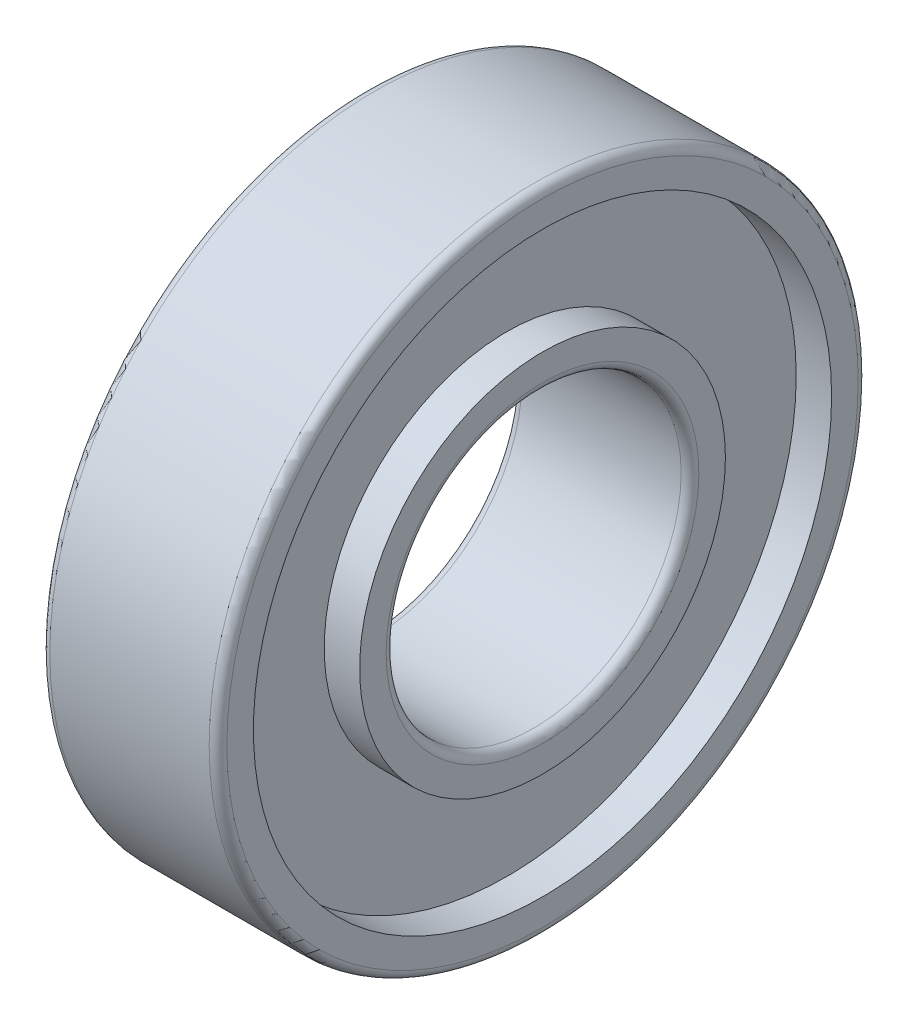
ISO-10303-21;
HEADER;
FILE_DESCRIPTION(('STEP AP214'),'2;1');
FILE_NAME('part.step','',(''),(''),'','','');
FILE_SCHEMA(('AUTOMOTIVE_DESIGN { 1 0 10303 214 1 1 1 1 }'));
ENDSEC;
DATA;
#1=APPLICATION_CONTEXT('core data for automotive mechanical design processes');
#2=APPLICATION_PROTOCOL_DEFINITION('international standard','automotive_design',2000,#1);
#3=PRODUCT_CONTEXT('',#1,'mechanical');
#4=PRODUCT('Part','Part','',(#3));
#5=PRODUCT_RELATED_PRODUCT_CATEGORY('part','',(#4));
#6=PRODUCT_DEFINITION_FORMATION('','',#4);
#7=PRODUCT_DEFINITION_CONTEXT('part definition',#1,'design');
#8=PRODUCT_DEFINITION('design','',#6,#7);
#9=PRODUCT_DEFINITION_SHAPE('','',#8);
#10=(LENGTH_UNIT() NAMED_UNIT(*) SI_UNIT(.MILLI.,.METRE.));
#11=(NAMED_UNIT(*) PLANE_ANGLE_UNIT() SI_UNIT($,.RADIAN.));
#12=(NAMED_UNIT(*) SI_UNIT($,.STERADIAN.) SOLID_ANGLE_UNIT());
#13=UNCERTAINTY_MEASURE_WITH_UNIT(LENGTH_MEASURE(1.E-05),#10,'distance_accuracy_value','');
#14=(GEOMETRIC_REPRESENTATION_CONTEXT(3) GLOBAL_UNCERTAINTY_ASSIGNED_CONTEXT((#13)) GLOBAL_UNIT_ASSIGNED_CONTEXT((#10,
#11,#12)) REPRESENTATION_CONTEXT('',''));
#15=CARTESIAN_POINT('',(0.,0.,0.));
#16=DIRECTION('',(0.,0.,1.));
#17=DIRECTION('',(1.,0.,0.));
#18=AXIS2_PLACEMENT_3D('',#15,#16,#17);
#19=CARTESIAN_POINT('',(0.,6.2,0.));
#20=DIRECTION('',(-1.,0.,0.));
#21=DIRECTION('',(0.,0.,1.));
#22=AXIS2_PLACEMENT_3D('',#19,#20,#21);
#23=PLANE('',#22);
#24=CARTESIAN_POINT('',(0.,0.,0.));
#25=DIRECTION('',(1.,0.,0.));
#26=DIRECTION('',(0.,0.,-1.));
#27=AXIS2_PLACEMENT_3D('',#24,#25,#26);
#28=CIRCLE('',#27,6.2);
#29=CARTESIAN_POINT('',(0.,0.,-6.2));
#30=VERTEX_POINT('',#29);
#31=EDGE_CURVE('E40',#30,#30,#28,.T.);
#32=ORIENTED_EDGE('',*,*,#31,.F.);
#33=EDGE_LOOP('',(#32));
#34=FACE_BOUND('',#33,.T.);
#35=CARTESIAN_POINT('',(0.,0.,0.));
#36=DIRECTION('',(1.,0.,0.));
#37=DIRECTION('',(0.,0.,-1.));
#38=AXIS2_PLACEMENT_3D('',#35,#36,#37);
#39=CIRCLE('',#38,5.3);
#40=CARTESIAN_POINT('',(0.,0.,-5.3));
#41=VERTEX_POINT('',#40);
#42=EDGE_CURVE('E11',#41,#41,#39,.T.);
#43=ORIENTED_EDGE('',*,*,#42,.T.);
#44=EDGE_LOOP('',(#43));
#45=FACE_BOUND('',#44,.T.);
#46=ADVANCED_FACE('F17',(#34,#45),#23,.T.);
#47=CARTESIAN_POINT('',(0.3,0.,0.));
#48=DIRECTION('',(1.,0.,0.));
#49=DIRECTION('',(0.,0.,-1.));
#50=AXIS2_PLACEMENT_3D('',#47,#48,#49);
#51=TOROIDAL_SURFACE('',#50,5.3,0.3);
#52=ORIENTED_EDGE('',*,*,#42,.F.);
#53=EDGE_LOOP('',(#52));
#54=FACE_BOUND('',#53,.T.);
#55=CARTESIAN_POINT('',(0.3,0.,0.));
#56=DIRECTION('',(1.,0.,0.));
#57=DIRECTION('',(0.,0.,-1.));
#58=AXIS2_PLACEMENT_3D('',#55,#56,#57);
#59=CIRCLE('',#58,5.);
#60=CARTESIAN_POINT('',(0.3,0.,-5.));
#61=VERTEX_POINT('',#60);
#62=EDGE_CURVE('E28',#61,#61,#59,.T.);
#63=ORIENTED_EDGE('',*,*,#62,.T.);
#64=EDGE_LOOP('',(#63));
#65=FACE_BOUND('',#64,.T.);
#66=ADVANCED_FACE('F169',(#54,#65),#51,.T.);
#67=CARTESIAN_POINT('',(6.,0.,0.));
#68=DIRECTION('',(-1.,0.,0.));
#69=DIRECTION('',(0.,0.,-1.));
#70=AXIS2_PLACEMENT_3D('',#67,#68,#69);
#71=CYLINDRICAL_SURFACE('',#70,5.);
#72=ORIENTED_EDGE('',*,*,#62,.F.);
#73=EDGE_LOOP('',(#72));
#74=FACE_BOUND('',#73,.T.);
#75=CARTESIAN_POINT('',(5.7,0.,0.));
#76=DIRECTION('',(1.,0.,0.));
#77=DIRECTION('',(0.,0.,-1.));
#78=AXIS2_PLACEMENT_3D('',#75,#76,#77);
#79=CIRCLE('',#78,5.);
#80=CARTESIAN_POINT('',(5.7,0.,-5.));
#81=VERTEX_POINT('',#80);
#82=EDGE_CURVE('E126',#81,#81,#79,.T.);
#83=ORIENTED_EDGE('',*,*,#82,.T.);
#84=EDGE_LOOP('',(#83));
#85=FACE_BOUND('',#84,.T.);
#86=ADVANCED_FACE('F173',(#74,#85),#71,.F.);
#87=CARTESIAN_POINT('',(5.7,0.,0.));
#88=DIRECTION('',(1.,0.,0.));
#89=DIRECTION('',(0.,0.,-1.));
#90=AXIS2_PLACEMENT_3D('',#87,#88,#89);
#91=TOROIDAL_SURFACE('',#90,5.3,0.3);
#92=ORIENTED_EDGE('',*,*,#82,.F.);
#93=EDGE_LOOP('',(#92));
#94=FACE_BOUND('',#93,.T.);
#95=CARTESIAN_POINT('',(6.,0.,0.));
#96=DIRECTION('',(1.,0.,0.));
#97=DIRECTION('',(0.,0.,-1.));
#98=AXIS2_PLACEMENT_3D('',#95,#96,#97);
#99=CIRCLE('',#98,5.3);
#100=CARTESIAN_POINT('',(6.,0.,-5.3));
#101=VERTEX_POINT('',#100);
#102=EDGE_CURVE('E122',#101,#101,#99,.T.);
#103=ORIENTED_EDGE('',*,*,#102,.T.);
#104=EDGE_LOOP('',(#103));
#105=FACE_BOUND('',#104,.T.);
#106=ADVANCED_FACE('F195',(#94,#105),#91,.T.);
#107=CARTESIAN_POINT('',(6.,5.3,0.));
#108=DIRECTION('',(1.,0.,0.));
#109=DIRECTION('',(0.,1.,0.));
#110=AXIS2_PLACEMENT_3D('',#107,#108,#109);
#111=PLANE('',#110);
#112=CARTESIAN_POINT('',(6.,0.,0.));
#113=DIRECTION('',(1.,0.,0.));
#114=DIRECTION('',(0.,0.,-1.));
#115=AXIS2_PLACEMENT_3D('',#112,#113,#114);
#116=CIRCLE('',#115,6.2);
#117=CARTESIAN_POINT('',(6.,0.,-6.2));
#118=VERTEX_POINT('',#117);
#119=EDGE_CURVE('E127',#118,#118,#116,.T.);
#120=ORIENTED_EDGE('',*,*,#119,.T.);
#121=EDGE_LOOP('',(#120));
#122=FACE_BOUND('',#121,.T.);
#123=ORIENTED_EDGE('',*,*,#102,.F.);
#124=EDGE_LOOP('',(#123));
#125=FACE_BOUND('',#124,.T.);
#126=ADVANCED_FACE('F201',(#122,#125),#111,.T.);
#127=CARTESIAN_POINT('',(6.,0.,0.));
#128=DIRECTION('',(-1.,0.,0.));
#129=DIRECTION('',(0.,0.,-1.));
#130=AXIS2_PLACEMENT_3D('',#127,#128,#129);
#131=CYLINDRICAL_SURFACE('',#130,6.2);
#132=ORIENTED_EDGE('',*,*,#119,.F.);
#133=EDGE_LOOP('',(#132));
#134=FACE_BOUND('',#133,.T.);
#135=CARTESIAN_POINT('',(4.8,0.,0.));
#136=DIRECTION('',(1.,0.,0.));
#137=DIRECTION('',(0.,0.,-1.));
#138=AXIS2_PLACEMENT_3D('',#135,#136,#137);
#139=CIRCLE('',#138,6.2);
#140=CARTESIAN_POINT('',(4.8,0.,-6.2));
#141=VERTEX_POINT('',#140);
#142=EDGE_CURVE('E21',#141,#141,#139,.T.);
#143=ORIENTED_EDGE('',*,*,#142,.T.);
#144=EDGE_LOOP('',(#143));
#145=FACE_BOUND('',#144,.T.);
#146=ADVANCED_FACE('F182',(#134,#145),#131,.T.);
#147=CARTESIAN_POINT('',(4.8,6.2,0.));
#148=DIRECTION('',(1.,0.,0.));
#149=DIRECTION('',(0.,1.,0.));
#150=AXIS2_PLACEMENT_3D('',#147,#148,#149);
#151=PLANE('',#150);
#152=CARTESIAN_POINT('',(4.8,0.,0.));
#153=DIRECTION('',(1.,0.,0.));
#154=DIRECTION('',(0.,0.,-1.));
#155=AXIS2_PLACEMENT_3D('',#152,#153,#154);
#156=CIRCLE('',#155,9.8);
#157=CARTESIAN_POINT('',(4.8,0.,-9.8));
#158=VERTEX_POINT('',#157);
#159=EDGE_CURVE('E119',#158,#158,#156,.T.);
#160=ORIENTED_EDGE('',*,*,#159,.T.);
#161=EDGE_LOOP('',(#160));
#162=FACE_BOUND('',#161,.T.);
#163=ORIENTED_EDGE('',*,*,#142,.F.);
#164=EDGE_LOOP('',(#163));
#165=FACE_BOUND('',#164,.T.);
#166=ADVANCED_FACE('F178',(#162,#165),#151,.T.);
#167=CARTESIAN_POINT('',(6.,0.,0.));
#168=DIRECTION('',(-1.,0.,0.));
#169=DIRECTION('',(0.,0.,-1.));
#170=AXIS2_PLACEMENT_3D('',#167,#168,#169);
#171=CYLINDRICAL_SURFACE('',#170,9.8);
#172=ORIENTED_EDGE('',*,*,#159,.F.);
#173=EDGE_LOOP('',(#172));
#174=FACE_BOUND('',#173,.T.);
#175=CARTESIAN_POINT('',(6.,0.,0.));
#176=DIRECTION('',(1.,0.,0.));
#177=DIRECTION('',(0.,0.,-1.));
#178=AXIS2_PLACEMENT_3D('',#175,#176,#177);
#179=CIRCLE('',#178,9.8);
#180=CARTESIAN_POINT('',(6.,0.,-9.8));
#181=VERTEX_POINT('',#180);
#182=EDGE_CURVE('E118',#181,#181,#179,.T.);
#183=ORIENTED_EDGE('',*,*,#182,.T.);
#184=EDGE_LOOP('',(#183));
#185=FACE_BOUND('',#184,.T.);
#186=ADVANCED_FACE('F181',(#174,#185),#171,.F.);
#187=CARTESIAN_POINT('',(6.,9.8,0.));
#188=DIRECTION('',(1.,0.,0.));
#189=DIRECTION('',(0.,1.,0.));
#190=AXIS2_PLACEMENT_3D('',#187,#188,#189);
#191=PLANE('',#190);
#192=CARTESIAN_POINT('',(6.,0.,0.));
#193=DIRECTION('',(1.,0.,0.));
#194=DIRECTION('',(0.,0.,-1.));
#195=AXIS2_PLACEMENT_3D('',#192,#193,#194);
#196=CIRCLE('',#195,10.7);
#197=CARTESIAN_POINT('',(6.,0.,-10.7));
#198=VERTEX_POINT('',#197);
#199=EDGE_CURVE('E128',#198,#198,#196,.T.);
#200=ORIENTED_EDGE('',*,*,#199,.T.);
#201=EDGE_LOOP('',(#200));
#202=FACE_BOUND('',#201,.T.);
#203=ORIENTED_EDGE('',*,*,#182,.F.);
#204=EDGE_LOOP('',(#203));
#205=FACE_BOUND('',#204,.T.);
#206=ADVANCED_FACE('F188',(#202,#205),#191,.T.);
#207=CARTESIAN_POINT('',(5.7,0.,0.));
#208=DIRECTION('',(1.,0.,0.));
#209=DIRECTION('',(0.,0.,-1.));
#210=AXIS2_PLACEMENT_3D('',#207,#208,#209);
#211=TOROIDAL_SURFACE('',#210,10.7,0.3);
#212=ORIENTED_EDGE('',*,*,#199,.F.);
#213=EDGE_LOOP('',(#212));
#214=FACE_BOUND('',#213,.T.);
#215=CARTESIAN_POINT('',(5.7,0.,0.));
#216=DIRECTION('',(1.,0.,0.));
#217=DIRECTION('',(0.,0.,-1.));
#218=AXIS2_PLACEMENT_3D('',#215,#216,#217);
#219=CIRCLE('',#218,11.);
#220=CARTESIAN_POINT('',(5.7,0.,-11.));
#221=VERTEX_POINT('',#220);
#222=EDGE_CURVE('E112',#221,#221,#219,.T.);
#223=ORIENTED_EDGE('',*,*,#222,.T.);
#224=EDGE_LOOP('',(#223));
#225=FACE_BOUND('',#224,.T.);
#226=ADVANCED_FACE('F184',(#214,#225),#211,.T.);
#227=CARTESIAN_POINT('',(6.,0.,0.));
#228=DIRECTION('',(-1.,0.,0.));
#229=DIRECTION('',(0.,0.,-1.));
#230=AXIS2_PLACEMENT_3D('',#227,#228,#229);
#231=CYLINDRICAL_SURFACE('',#230,11.);
#232=ORIENTED_EDGE('',*,*,#222,.F.);
#233=EDGE_LOOP('',(#232));
#234=FACE_BOUND('',#233,.T.);
#235=CARTESIAN_POINT('',(0.3,0.,0.));
#236=DIRECTION('',(1.,0.,0.));
#237=DIRECTION('',(0.,0.,-1.));
#238=AXIS2_PLACEMENT_3D('',#235,#236,#237);
#239=CIRCLE('',#238,11.);
#240=CARTESIAN_POINT('',(0.3,0.,-11.));
#241=VERTEX_POINT('',#240);
#242=EDGE_CURVE('E105',#241,#241,#239,.T.);
#243=ORIENTED_EDGE('',*,*,#242,.T.);
#244=EDGE_LOOP('',(#243));
#245=FACE_BOUND('',#244,.T.);
#246=ADVANCED_FACE('F187',(#234,#245),#231,.T.);
#247=CARTESIAN_POINT('',(0.3,0.,0.));
#248=DIRECTION('',(1.,0.,0.));
#249=DIRECTION('',(0.,0.,-1.));
#250=AXIS2_PLACEMENT_3D('',#247,#248,#249);
#251=TOROIDAL_SURFACE('',#250,10.7,0.3);
#252=ORIENTED_EDGE('',*,*,#242,.F.);
#253=EDGE_LOOP('',(#252));
#254=FACE_BOUND('',#253,.T.);
#255=CARTESIAN_POINT('',(0.,0.,0.));
#256=DIRECTION('',(1.,0.,0.));
#257=DIRECTION('',(0.,0.,-1.));
#258=AXIS2_PLACEMENT_3D('',#255,#256,#257);
#259=CIRCLE('',#258,10.7);
#260=CARTESIAN_POINT('',(0.,0.,-10.7));
#261=VERTEX_POINT('',#260);
#262=EDGE_CURVE('E101',#261,#261,#259,.T.);
#263=ORIENTED_EDGE('',*,*,#262,.T.);
#264=EDGE_LOOP('',(#263));
#265=FACE_BOUND('',#264,.T.);
#266=ADVANCED_FACE('F220',(#254,#265),#251,.T.);
#267=CARTESIAN_POINT('',(0.,10.7,0.));
#268=DIRECTION('',(-1.,0.,0.));
#269=DIRECTION('',(0.,0.,1.));
#270=AXIS2_PLACEMENT_3D('',#267,#268,#269);
#271=PLANE('',#270);
#272=ORIENTED_EDGE('',*,*,#262,.F.);
#273=EDGE_LOOP('',(#272));
#274=FACE_BOUND('',#273,.T.);
#275=CARTESIAN_POINT('',(0.,0.,0.));
#276=DIRECTION('',(1.,0.,0.));
#277=DIRECTION('',(0.,0.,-1.));
#278=AXIS2_PLACEMENT_3D('',#275,#276,#277);
#279=CIRCLE('',#278,9.8);
#280=CARTESIAN_POINT('',(0.,0.,-9.8));
#281=VERTEX_POINT('',#280);
#282=EDGE_CURVE('E94',#281,#281,#279,.T.);
#283=ORIENTED_EDGE('',*,*,#282,.T.);
#284=EDGE_LOOP('',(#283));
#285=FACE_BOUND('',#284,.T.);
#286=ADVANCED_FACE('F19',(#274,#285),#271,.T.);
#287=CARTESIAN_POINT('',(6.,0.,0.));
#288=DIRECTION('',(-1.,0.,0.));
#289=DIRECTION('',(0.,0.,-1.));
#290=AXIS2_PLACEMENT_3D('',#287,#288,#289);
#291=CYLINDRICAL_SURFACE('',#290,9.8);
#292=ORIENTED_EDGE('',*,*,#282,.F.);
#293=EDGE_LOOP('',(#292));
#294=FACE_BOUND('',#293,.T.);
#295=CARTESIAN_POINT('',(1.2,0.,0.));
#296=DIRECTION('',(1.,0.,0.));
#297=DIRECTION('',(0.,0.,-1.));
#298=AXIS2_PLACEMENT_3D('',#295,#296,#297);
#299=CIRCLE('',#298,9.8);
#300=CARTESIAN_POINT('',(1.2,0.,-9.8));
#301=VERTEX_POINT('',#300);
#302=EDGE_CURVE('E114',#301,#301,#299,.T.);
#303=ORIENTED_EDGE('',*,*,#302,.T.);
#304=EDGE_LOOP('',(#303));
#305=FACE_BOUND('',#304,.T.);
#306=ADVANCED_FACE('F163',(#294,#305),#291,.F.);
#307=CARTESIAN_POINT('',(1.2,9.8,0.));
#308=DIRECTION('',(-1.,0.,0.));
#309=DIRECTION('',(0.,0.,1.));
#310=AXIS2_PLACEMENT_3D('',#307,#308,#309);
#311=PLANE('',#310);
#312=ORIENTED_EDGE('',*,*,#302,.F.);
#313=EDGE_LOOP('',(#312));
#314=FACE_BOUND('',#313,.T.);
#315=CARTESIAN_POINT('',(1.2,0.,0.));
#316=DIRECTION('',(1.,0.,0.));
#317=DIRECTION('',(0.,0.,-1.));
#318=AXIS2_PLACEMENT_3D('',#315,#316,#317);
#319=CIRCLE('',#318,6.2);
#320=CARTESIAN_POINT('',(1.2,0.,-6.2));
#321=VERTEX_POINT('',#320);
#322=EDGE_CURVE('E135',#321,#321,#319,.T.);
#323=ORIENTED_EDGE('',*,*,#322,.T.);
#324=EDGE_LOOP('',(#323));
#325=FACE_BOUND('',#324,.T.);
#326=ADVANCED_FACE('F156',(#314,#325),#311,.T.);
#327=CARTESIAN_POINT('',(6.,0.,0.));
#328=DIRECTION('',(-1.,0.,0.));
#329=DIRECTION('',(0.,0.,-1.));
#330=AXIS2_PLACEMENT_3D('',#327,#328,#329);
#331=CYLINDRICAL_SURFACE('',#330,6.2);
#332=ORIENTED_EDGE('',*,*,#322,.F.);
#333=EDGE_LOOP('',(#332));
#334=FACE_BOUND('',#333,.T.);
#335=ORIENTED_EDGE('',*,*,#31,.T.);
#336=EDGE_LOOP('',(#335));
#337=FACE_BOUND('',#336,.T.);
#338=ADVANCED_FACE('F154',(#334,#337),#331,.T.);
#339=CLOSED_SHELL('',(#46,#66,#86,#106,#126,#146,#166,#186,#206,#226,#246,#266,#286,#306,#326,#338));
#340=MANIFOLD_SOLID_BREP('B1',#339);
#341=ADVANCED_BREP_SHAPE_REPRESENTATION('',(#18,#340),#14);
#342=SHAPE_DEFINITION_REPRESENTATION(#9,#341);
ENDSEC;
END-ISO-10303-21;
